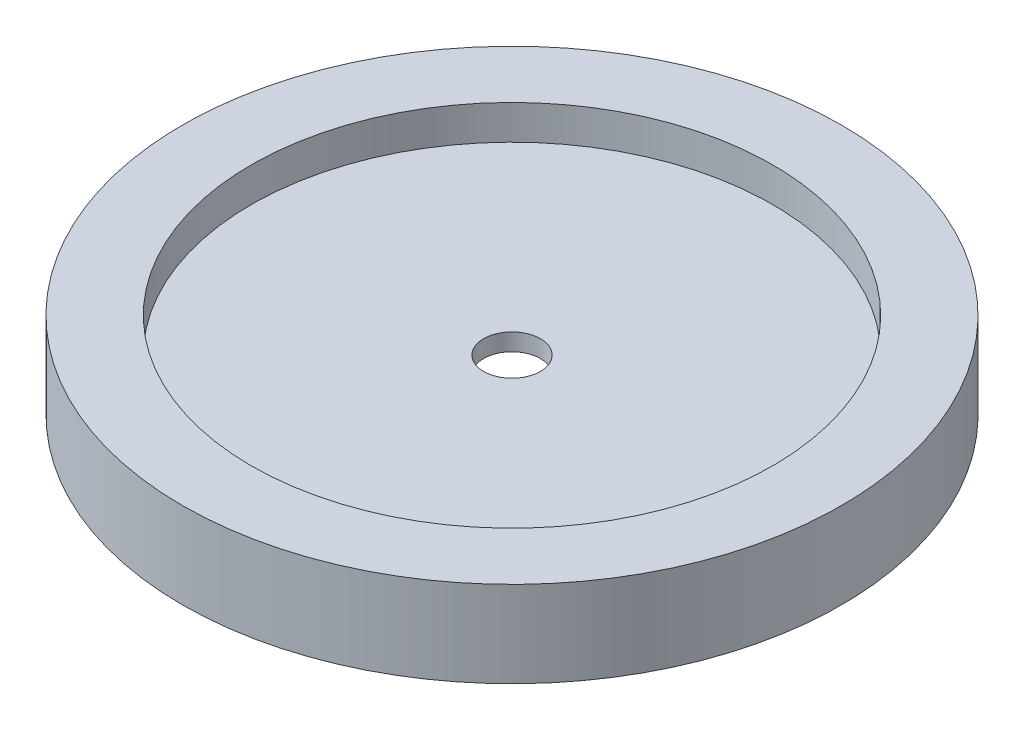
ISO-10303-21;
HEADER;
FILE_DESCRIPTION(('STEP AP214'),'2;1');
FILE_NAME('part.step','',(''),(''),'','','');
FILE_SCHEMA(('AUTOMOTIVE_DESIGN { 1 0 10303 214 1 1 1 1 }'));
ENDSEC;
DATA;
#1=APPLICATION_CONTEXT('core data for automotive mechanical design processes');
#2=APPLICATION_PROTOCOL_DEFINITION('international standard','automotive_design',2000,#1);
#3=PRODUCT_CONTEXT('',#1,'mechanical');
#4=PRODUCT('Part','Part','',(#3));
#5=PRODUCT_RELATED_PRODUCT_CATEGORY('part','',(#4));
#6=PRODUCT_DEFINITION_FORMATION('','',#4);
#7=PRODUCT_DEFINITION_CONTEXT('part definition',#1,'design');
#8=PRODUCT_DEFINITION('design','',#6,#7);
#9=PRODUCT_DEFINITION_SHAPE('','',#8);
#10=(LENGTH_UNIT() NAMED_UNIT(*) SI_UNIT(.MILLI.,.METRE.));
#11=(NAMED_UNIT(*) PLANE_ANGLE_UNIT() SI_UNIT($,.RADIAN.));
#12=(NAMED_UNIT(*) SI_UNIT($,.STERADIAN.) SOLID_ANGLE_UNIT());
#13=UNCERTAINTY_MEASURE_WITH_UNIT(LENGTH_MEASURE(1.E-05),#10,'distance_accuracy_value','');
#14=(GEOMETRIC_REPRESENTATION_CONTEXT(3) GLOBAL_UNCERTAINTY_ASSIGNED_CONTEXT((#13)) GLOBAL_UNIT_ASSIGNED_CONTEXT((#10,
#11,#12)) REPRESENTATION_CONTEXT('',''));
#15=CARTESIAN_POINT('',(0.,0.,0.));
#16=DIRECTION('',(0.,0.,1.));
#17=DIRECTION('',(1.,0.,0.));
#18=AXIS2_PLACEMENT_3D('',#15,#16,#17);
#19=CARTESIAN_POINT('',(0.,1.,0.));
#20=DIRECTION('',(0.,1.,0.));
#21=DIRECTION('',(0.,0.,1.));
#22=AXIS2_PLACEMENT_3D('',#19,#20,#21);
#23=PLANE('',#22);
#24=CARTESIAN_POINT('',(0.,1.,0.));
#25=DIRECTION('',(0.,1.,0.));
#26=DIRECTION('',(0.,0.,1.));
#27=AXIS2_PLACEMENT_3D('',#24,#25,#26);
#28=CIRCLE('',#27,9.575);
#29=CARTESIAN_POINT('',(0.,1.,9.575));
#30=VERTEX_POINT('',#29);
#31=EDGE_CURVE('E50',#30,#30,#28,.T.);
#32=ORIENTED_EDGE('',*,*,#31,.T.);
#33=EDGE_LOOP('',(#32));
#34=FACE_BOUND('',#33,.T.);
#35=CARTESIAN_POINT('',(0.,1.,0.));
#36=DIRECTION('',(0.,1.,0.));
#37=DIRECTION('',(0.,0.,1.));
#38=AXIS2_PLACEMENT_3D('',#35,#36,#37);
#39=CIRCLE('',#38,7.575);
#40=CARTESIAN_POINT('',(0.,1.,7.575));
#41=VERTEX_POINT('',#40);
#42=EDGE_CURVE('E55',#41,#41,#39,.T.);
#43=ORIENTED_EDGE('',*,*,#42,.F.);
#44=EDGE_LOOP('',(#43));
#45=FACE_BOUND('',#44,.T.);
#46=ADVANCED_FACE('F37',(#34,#45),#23,.T.);
#47=CARTESIAN_POINT('',(0.,1.,0.));
#48=DIRECTION('',(0.,-1.,0.));
#49=DIRECTION('',(0.,0.,-1.));
#50=AXIS2_PLACEMENT_3D('',#47,#48,#49);
#51=CYLINDRICAL_SURFACE('',#50,9.575);
#52=ORIENTED_EDGE('',*,*,#31,.F.);
#53=EDGE_LOOP('',(#52));
#54=FACE_BOUND('',#53,.T.);
#55=CARTESIAN_POINT('',(0.,-1.5,0.));
#56=DIRECTION('',(0.,-1.,0.));
#57=DIRECTION('',(0.,0.,-1.));
#58=AXIS2_PLACEMENT_3D('',#55,#56,#57);
#59=CIRCLE('',#58,9.575);
#60=CARTESIAN_POINT('',(0.,-1.5,-9.575));
#61=VERTEX_POINT('',#60);
#62=EDGE_CURVE('E59',#61,#61,#59,.T.);
#63=ORIENTED_EDGE('',*,*,#62,.F.);
#64=EDGE_LOOP('',(#63));
#65=FACE_BOUND('',#64,.T.);
#66=ADVANCED_FACE('F87',(#54,#65),#51,.T.);
#67=CARTESIAN_POINT('',(0.,1.,0.));
#68=DIRECTION('',(0.,-1.,0.));
#69=DIRECTION('',(0.,0.,-1.));
#70=AXIS2_PLACEMENT_3D('',#67,#68,#69);
#71=CYLINDRICAL_SURFACE('',#70,7.575);
#72=ORIENTED_EDGE('',*,*,#42,.T.);
#73=EDGE_LOOP('',(#72));
#74=FACE_BOUND('',#73,.T.);
#75=CARTESIAN_POINT('',(0.,0.,0.));
#76=DIRECTION('',(0.,1.,0.));
#77=DIRECTION('',(0.,0.,1.));
#78=AXIS2_PLACEMENT_3D('',#75,#76,#77);
#79=CIRCLE('',#78,7.575);
#80=CARTESIAN_POINT('',(0.,0.,7.575));
#81=VERTEX_POINT('',#80);
#82=EDGE_CURVE('E56',#81,#81,#79,.T.);
#83=ORIENTED_EDGE('',*,*,#82,.F.);
#84=EDGE_LOOP('',(#83));
#85=FACE_BOUND('',#84,.T.);
#86=ADVANCED_FACE('F93',(#74,#85),#71,.F.);
#87=CARTESIAN_POINT('',(0.,0.,0.));
#88=DIRECTION('',(0.,-1.,0.));
#89=DIRECTION('',(0.,0.,-1.));
#90=AXIS2_PLACEMENT_3D('',#87,#88,#89);
#91=PLANE('',#90);
#92=CARTESIAN_POINT('',(0.,0.,0.));
#93=DIRECTION('',(0.,-1.,0.));
#94=DIRECTION('',(0.,0.,-1.));
#95=AXIS2_PLACEMENT_3D('',#92,#93,#94);
#96=CIRCLE('',#95,0.825);
#97=CARTESIAN_POINT('',(0.,0.,-0.825));
#98=VERTEX_POINT('',#97);
#99=EDGE_CURVE('E42',#98,#98,#96,.T.);
#100=ORIENTED_EDGE('',*,*,#99,.T.);
#101=EDGE_LOOP('',(#100));
#102=FACE_BOUND('',#101,.T.);
#103=ORIENTED_EDGE('',*,*,#82,.T.);
#104=EDGE_LOOP('',(#103));
#105=FACE_BOUND('',#104,.T.);
#106=ADVANCED_FACE('F74',(#102,#105),#91,.F.);
#107=CARTESIAN_POINT('',(0.,-1.5,0.));
#108=DIRECTION('',(0.,-1.,0.));
#109=DIRECTION('',(0.,0.,-1.));
#110=AXIS2_PLACEMENT_3D('',#107,#108,#109);
#111=PLANE('',#110);
#112=CARTESIAN_POINT('',(0.,-1.5,0.));
#113=DIRECTION('',(0.,-1.,0.));
#114=DIRECTION('',(0.,0.,-1.));
#115=AXIS2_PLACEMENT_3D('',#112,#113,#114);
#116=CIRCLE('',#115,2.775);
#117=CARTESIAN_POINT('',(0.,-1.5,-2.775));
#118=VERTEX_POINT('',#117);
#119=EDGE_CURVE('E10',#118,#118,#116,.F.);
#120=ORIENTED_EDGE('',*,*,#119,.T.);
#121=EDGE_LOOP('',(#120));
#122=FACE_BOUND('',#121,.T.);
#123=ORIENTED_EDGE('',*,*,#62,.T.);
#124=EDGE_LOOP('',(#123));
#125=FACE_BOUND('',#124,.T.);
#126=ADVANCED_FACE('F102',(#122,#125),#111,.T.);
#127=CARTESIAN_POINT('',(0.,-0.5,0.));
#128=DIRECTION('',(0.,-1.,0.));
#129=DIRECTION('',(0.,0.,-1.));
#130=AXIS2_PLACEMENT_3D('',#127,#128,#129);
#131=CYLINDRICAL_SURFACE('',#130,2.575);
#132=CARTESIAN_POINT('',(0.,-1.3,0.));
#133=DIRECTION('',(0.,-1.,0.));
#134=DIRECTION('',(0.,0.,-1.));
#135=AXIS2_PLACEMENT_3D('',#132,#133,#134);
#136=CIRCLE('',#135,2.575);
#137=CARTESIAN_POINT('',(0.,-1.3,-2.575));
#138=VERTEX_POINT('',#137);
#139=EDGE_CURVE('E46',#138,#138,#136,.T.);
#140=ORIENTED_EDGE('',*,*,#139,.T.);
#141=EDGE_LOOP('',(#140));
#142=FACE_BOUND('',#141,.T.);
#143=CARTESIAN_POINT('',(0.,-0.5,0.));
#144=DIRECTION('',(0.,-1.,0.));
#145=DIRECTION('',(0.,0.,-1.));
#146=AXIS2_PLACEMENT_3D('',#143,#144,#145);
#147=CIRCLE('',#146,2.575);
#148=CARTESIAN_POINT('',(0.,-0.5,-2.575));
#149=VERTEX_POINT('',#148);
#150=EDGE_CURVE('E64',#149,#149,#147,.T.);
#151=ORIENTED_EDGE('',*,*,#150,.F.);
#152=EDGE_LOOP('',(#151));
#153=FACE_BOUND('',#152,.T.);
#154=ADVANCED_FACE('F105',(#142,#153),#131,.F.);
#155=CARTESIAN_POINT('',(0.,-0.5,0.));
#156=DIRECTION('',(0.,-1.,0.));
#157=DIRECTION('',(0.,0.,-1.));
#158=AXIS2_PLACEMENT_3D('',#155,#156,#157);
#159=PLANE('',#158);
#160=CARTESIAN_POINT('',(0.,-0.5,0.));
#161=DIRECTION('',(0.,-1.,0.));
#162=DIRECTION('',(0.,0.,-1.));
#163=AXIS2_PLACEMENT_3D('',#160,#161,#162);
#164=CIRCLE('',#163,0.825);
#165=CARTESIAN_POINT('',(0.,-0.5,-0.825));
#166=VERTEX_POINT('',#165);
#167=EDGE_CURVE('E67',#166,#166,#164,.T.);
#168=ORIENTED_EDGE('',*,*,#167,.F.);
#169=EDGE_LOOP('',(#168));
#170=FACE_BOUND('',#169,.T.);
#171=ORIENTED_EDGE('',*,*,#150,.T.);
#172=EDGE_LOOP('',(#171));
#173=FACE_BOUND('',#172,.T.);
#174=ADVANCED_FACE('F83',(#170,#173),#159,.T.);
#175=CARTESIAN_POINT('',(0.,-1.3,0.));
#176=DIRECTION('',(0.,-1.,0.));
#177=DIRECTION('',(0.,0.,-1.));
#178=AXIS2_PLACEMENT_3D('',#175,#176,#177);
#179=CONICAL_SURFACE('',#178,2.575,0.785398163397454);
#180=ORIENTED_EDGE('',*,*,#119,.F.);
#181=EDGE_LOOP('',(#180));
#182=FACE_BOUND('',#181,.T.);
#183=ORIENTED_EDGE('',*,*,#139,.F.);
#184=EDGE_LOOP('',(#183));
#185=FACE_BOUND('',#184,.T.);
#186=ADVANCED_FACE('F40',(#182,#185),#179,.F.);
#187=CARTESIAN_POINT('',(0.,1.,0.));
#188=DIRECTION('',(0.,-1.,0.));
#189=DIRECTION('',(0.,0.,-1.));
#190=AXIS2_PLACEMENT_3D('',#187,#188,#189);
#191=CYLINDRICAL_SURFACE('',#190,0.825);
#192=ORIENTED_EDGE('',*,*,#167,.T.);
#193=EDGE_LOOP('',(#192));
#194=FACE_BOUND('',#193,.T.);
#195=ORIENTED_EDGE('',*,*,#99,.F.);
#196=EDGE_LOOP('',(#195));
#197=FACE_BOUND('',#196,.T.);
#198=ADVANCED_FACE('F77',(#194,#197),#191,.F.);
#199=CLOSED_SHELL('',(#46,#66,#86,#106,#126,#154,#174,#186,#198));
#200=MANIFOLD_SOLID_BREP('B2',#199);
#201=ADVANCED_BREP_SHAPE_REPRESENTATION('',(#18,#200),#14);
#202=SHAPE_DEFINITION_REPRESENTATION(#9,#201);
ENDSEC;
END-ISO-10303-21;
